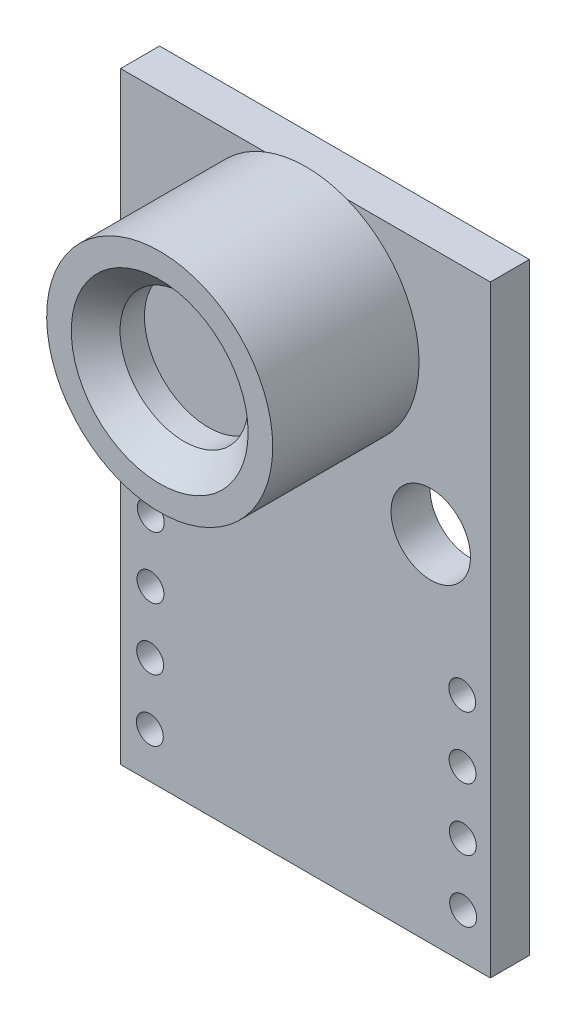
ISO-10303-21;
HEADER;
FILE_DESCRIPTION(('STEP AP214'),'2;1');
FILE_NAME('part.step','',(''),(''),'','','');
FILE_SCHEMA(('AUTOMOTIVE_DESIGN { 1 0 10303 214 1 1 1 1 }'));
ENDSEC;
DATA;
#1=APPLICATION_CONTEXT('core data for automotive mechanical design processes');
#2=APPLICATION_PROTOCOL_DEFINITION('international standard','automotive_design',2000,#1);
#3=PRODUCT_CONTEXT('',#1,'mechanical');
#4=PRODUCT('Part','Part','',(#3));
#5=PRODUCT_RELATED_PRODUCT_CATEGORY('part','',(#4));
#6=PRODUCT_DEFINITION_FORMATION('','',#4);
#7=PRODUCT_DEFINITION_CONTEXT('part definition',#1,'design');
#8=PRODUCT_DEFINITION('design','',#6,#7);
#9=PRODUCT_DEFINITION_SHAPE('','',#8);
#10=(LENGTH_UNIT() NAMED_UNIT(*) SI_UNIT(.MILLI.,.METRE.));
#11=(NAMED_UNIT(*) PLANE_ANGLE_UNIT() SI_UNIT($,.RADIAN.));
#12=(NAMED_UNIT(*) SI_UNIT($,.STERADIAN.) SOLID_ANGLE_UNIT());
#13=UNCERTAINTY_MEASURE_WITH_UNIT(LENGTH_MEASURE(1.E-05),#10,'distance_accuracy_value','');
#14=(GEOMETRIC_REPRESENTATION_CONTEXT(3) GLOBAL_UNCERTAINTY_ASSIGNED_CONTEXT((#13)) GLOBAL_UNIT_ASSIGNED_CONTEXT((#10,
#11,#12)) REPRESENTATION_CONTEXT('',''));
#15=CARTESIAN_POINT('',(0.,0.,0.));
#16=DIRECTION('',(0.,0.,1.));
#17=DIRECTION('',(1.,0.,0.));
#18=AXIS2_PLACEMENT_3D('',#15,#16,#17);
#19=CARTESIAN_POINT('',(0.264950996906967,193.999574927184,-1.6));
#20=DIRECTION('',(-1.,0.,0.));
#21=DIRECTION('',(0.,0.,1.));
#22=AXIS2_PLACEMENT_3D('',#19,#20,#21);
#23=PLANE('',#22);
#24=DIRECTION('',(0.,-1.,0.));
#25=VECTOR('',#24,1.);
#26=CARTESIAN_POINT('',(0.264950996906967,193.999574927184,0.));
#27=LINE('',#26,#25);
#28=CARTESIAN_POINT('',(0.264950996906967,193.999574927184,0.));
#29=VERTEX_POINT('',#28);
#30=CARTESIAN_POINT('',(0.264950996906967,169.281474992154,0.));
#31=VERTEX_POINT('',#30);
#32=EDGE_CURVE('E214',#29,#31,#27,.T.);
#33=ORIENTED_EDGE('',*,*,#32,.F.);
#34=DIRECTION('',(0.,0.,1.));
#35=VECTOR('',#34,1.);
#36=CARTESIAN_POINT('',(0.264950996906967,193.999574927184,-1.6));
#37=LINE('',#36,#35);
#38=CARTESIAN_POINT('',(0.264950996906967,193.999574927184,-1.6));
#39=VERTEX_POINT('',#38);
#40=EDGE_CURVE('E69',#39,#29,#37,.T.);
#41=ORIENTED_EDGE('',*,*,#40,.F.);
#42=DIRECTION('',(0.,-1.,0.));
#43=VECTOR('',#42,1.);
#44=CARTESIAN_POINT('',(0.264950996906967,193.999574927184,-1.6));
#45=LINE('',#44,#43);
#46=CARTESIAN_POINT('',(0.264950996906967,169.281474992154,-1.6));
#47=VERTEX_POINT('',#46);
#48=EDGE_CURVE('E109',#39,#47,#45,.T.);
#49=ORIENTED_EDGE('',*,*,#48,.T.);
#50=DIRECTION('',(0.,0.,1.));
#51=VECTOR('',#50,1.);
#52=CARTESIAN_POINT('',(0.264950996906967,169.281474992154,-1.6));
#53=LINE('',#52,#51);
#54=EDGE_CURVE('E94',#47,#31,#53,.T.);
#55=ORIENTED_EDGE('',*,*,#54,.T.);
#56=EDGE_LOOP('',(#33,#41,#49,#55));
#57=FACE_BOUND('',#56,.T.);
#58=ADVANCED_FACE('F44',(#57),#23,.T.);
#59=CARTESIAN_POINT('',(0.264950996906967,193.999574927184,-1.6));
#60=DIRECTION('',(0.,1.,0.));
#61=DIRECTION('',(0.,0.,1.));
#62=AXIS2_PLACEMENT_3D('',#59,#60,#61);
#63=PLANE('',#62);
#64=DIRECTION('',(-1.,0.,0.));
#65=VECTOR('',#64,1.);
#66=CARTESIAN_POINT('',(0.264950996906967,193.999574927184,0.));
#67=LINE('',#66,#65);
#68=CARTESIAN_POINT('',(15.4280169583826,193.999574927184,0.));
#69=VERTEX_POINT('',#68);
#70=CARTESIAN_POINT('',(9.55157956421883,193.999574927184,0.));
#71=VERTEX_POINT('',#70);
#72=EDGE_CURVE('E100',#69,#71,#67,.T.);
#73=ORIENTED_EDGE('',*,*,#72,.F.);
#74=DIRECTION('',(0.,0.,1.));
#75=VECTOR('',#74,1.);
#76=CARTESIAN_POINT('',(15.4280169583826,193.999574927184,-1.6));
#77=LINE('',#76,#75);
#78=CARTESIAN_POINT('',(15.4280169583826,193.999574927184,-1.6));
#79=VERTEX_POINT('',#78);
#80=EDGE_CURVE('E239',#79,#69,#77,.T.);
#81=ORIENTED_EDGE('',*,*,#80,.F.);
#82=DIRECTION('',(-1.,0.,0.));
#83=VECTOR('',#82,1.);
#84=CARTESIAN_POINT('',(0.264950996906967,193.999574927184,-1.6));
#85=LINE('',#84,#83);
#86=EDGE_CURVE('E227',#79,#39,#85,.T.);
#87=ORIENTED_EDGE('',*,*,#86,.T.);
#88=ORIENTED_EDGE('',*,*,#40,.T.);
#89=CARTESIAN_POINT('',(6.18847631750052,193.999574927184,0.));
#90=VERTEX_POINT('',#89);
#91=EDGE_CURVE('E88',#90,#29,#67,.T.);
#92=ORIENTED_EDGE('',*,*,#91,.F.);
#93=EDGE_CURVE('E110',#71,#90,#67,.T.);
#94=ORIENTED_EDGE('',*,*,#93,.F.);
#95=EDGE_LOOP('',(#73,#81,#87,#88,#92,#94));
#96=FACE_BOUND('',#95,.T.);
#97=ADVANCED_FACE('F113',(#96),#63,.T.);
#98=CARTESIAN_POINT('',(15.4280169583826,193.999574927184,-1.6));
#99=DIRECTION('',(1.,0.,0.));
#100=DIRECTION('',(0.,0.,-1.));
#101=AXIS2_PLACEMENT_3D('',#98,#99,#100);
#102=PLANE('',#101);
#103=DIRECTION('',(0.,1.,0.));
#104=VECTOR('',#103,1.);
#105=CARTESIAN_POINT('',(15.4280169583826,193.999574927184,0.));
#106=LINE('',#105,#104);
#107=CARTESIAN_POINT('',(15.4280169583826,169.281474992154,0.));
#108=VERTEX_POINT('',#107);
#109=EDGE_CURVE('E106',#108,#69,#106,.T.);
#110=ORIENTED_EDGE('',*,*,#109,.F.);
#111=DIRECTION('',(0.,0.,1.));
#112=VECTOR('',#111,1.);
#113=CARTESIAN_POINT('',(15.4280169583826,169.281474992154,-1.6));
#114=LINE('',#113,#112);
#115=CARTESIAN_POINT('',(15.4280169583826,169.281474992154,-1.6));
#116=VERTEX_POINT('',#115);
#117=EDGE_CURVE('E242',#116,#108,#114,.T.);
#118=ORIENTED_EDGE('',*,*,#117,.F.);
#119=DIRECTION('',(0.,1.,0.));
#120=VECTOR('',#119,1.);
#121=CARTESIAN_POINT('',(15.4280169583826,193.999574927184,-1.6));
#122=LINE('',#121,#120);
#123=EDGE_CURVE('E223',#116,#79,#122,.T.);
#124=ORIENTED_EDGE('',*,*,#123,.T.);
#125=ORIENTED_EDGE('',*,*,#80,.T.);
#126=EDGE_LOOP('',(#110,#118,#124,#125));
#127=FACE_BOUND('',#126,.T.);
#128=ADVANCED_FACE('F266',(#127),#102,.T.);
#129=CARTESIAN_POINT('',(0.264950996906967,169.281474992154,-1.6));
#130=DIRECTION('',(0.,-1.,0.));
#131=DIRECTION('',(0.,0.,-1.));
#132=AXIS2_PLACEMENT_3D('',#129,#130,#131);
#133=PLANE('',#132);
#134=DIRECTION('',(1.,0.,0.));
#135=VECTOR('',#134,1.);
#136=CARTESIAN_POINT('',(0.264950996906967,169.281474992154,0.));
#137=LINE('',#136,#135);
#138=EDGE_CURVE('E232',#31,#108,#137,.T.);
#139=ORIENTED_EDGE('',*,*,#138,.F.);
#140=ORIENTED_EDGE('',*,*,#54,.F.);
#141=DIRECTION('',(1.,0.,0.));
#142=VECTOR('',#141,1.);
#143=CARTESIAN_POINT('',(0.264950996906967,169.281474992154,-1.6));
#144=LINE('',#143,#142);
#145=EDGE_CURVE('E220',#47,#116,#144,.T.);
#146=ORIENTED_EDGE('',*,*,#145,.T.);
#147=ORIENTED_EDGE('',*,*,#117,.T.);
#148=EDGE_LOOP('',(#139,#140,#146,#147));
#149=FACE_BOUND('',#148,.T.);
#150=ADVANCED_FACE('F269',(#149),#133,.T.);
#151=CARTESIAN_POINT('',(0.,0.,-1.6));
#152=DIRECTION('',(0.,0.,1.));
#153=DIRECTION('',(1.,0.,0.));
#154=AXIS2_PLACEMENT_3D('',#151,#152,#153);
#155=PLANE('',#154);
#156=CARTESIAN_POINT('',(14.2757724092747,178.757435176001,-1.6));
#157=DIRECTION('',(0.,0.,1.));
#158=DIRECTION('',(-1.,0.,0.));
#159=AXIS2_PLACEMENT_3D('',#156,#157,#158);
#160=CIRCLE('',#159,0.551783112449994);
#161=CARTESIAN_POINT('',(13.7239892968247,178.757435176001,-1.6));
#162=VERTEX_POINT('',#161);
#163=EDGE_CURVE('E138',#162,#162,#160,.T.);
#164=ORIENTED_EDGE('',*,*,#163,.T.);
#165=EDGE_LOOP('',(#164));
#166=FACE_BOUND('',#165,.T.);
#167=CARTESIAN_POINT('',(14.2884354339846,176.217466741589,-1.6));
#168=DIRECTION('',(0.,0.,1.));
#169=DIRECTION('',(-1.,0.,0.));
#170=AXIS2_PLACEMENT_3D('',#167,#168,#169);
#171=CIRCLE('',#170,0.551783112449994);
#172=CARTESIAN_POINT('',(13.7366523215346,176.217466741589,-1.6));
#173=VERTEX_POINT('',#172);
#174=EDGE_CURVE('E146',#173,#173,#171,.T.);
#175=ORIENTED_EDGE('',*,*,#174,.T.);
#176=EDGE_LOOP('',(#175));
#177=FACE_BOUND('',#176,.T.);
#178=CARTESIAN_POINT('',(14.3010984586945,173.677498307178,-1.6));
#179=DIRECTION('',(0.,0.,1.));
#180=DIRECTION('',(-1.,0.,0.));
#181=AXIS2_PLACEMENT_3D('',#178,#179,#180);
#182=CIRCLE('',#181,0.551783112449994);
#183=CARTESIAN_POINT('',(13.7493153462445,173.677498307178,-1.6));
#184=VERTEX_POINT('',#183);
#185=EDGE_CURVE('E154',#184,#184,#182,.T.);
#186=ORIENTED_EDGE('',*,*,#185,.T.);
#187=EDGE_LOOP('',(#186));
#188=FACE_BOUND('',#187,.T.);
#189=CARTESIAN_POINT('',(14.3137614834045,171.137529872767,-1.6));
#190=DIRECTION('',(0.,0.,1.));
#191=DIRECTION('',(-1.,0.,0.));
#192=AXIS2_PLACEMENT_3D('',#189,#190,#191);
#193=CIRCLE('',#192,0.551783112449994);
#194=CARTESIAN_POINT('',(13.7619783709545,171.137529872767,-1.6));
#195=VERTEX_POINT('',#194);
#196=EDGE_CURVE('E162',#195,#195,#193,.T.);
#197=ORIENTED_EDGE('',*,*,#196,.T.);
#198=EDGE_LOOP('',(#197));
#199=FACE_BOUND('',#198,.T.);
#200=CARTESIAN_POINT('',(1.46546972722126,171.137529872767,-1.6));
#201=DIRECTION('',(0.,0.,1.));
#202=DIRECTION('',(1.,0.,0.));
#203=AXIS2_PLACEMENT_3D('',#200,#201,#202);
#204=CIRCLE('',#203,0.551783112449994);
#205=CARTESIAN_POINT('',(2.01725283967125,171.137529872767,-1.6));
#206=VERTEX_POINT('',#205);
#207=EDGE_CURVE('E170',#206,#206,#204,.T.);
#208=ORIENTED_EDGE('',*,*,#207,.T.);
#209=EDGE_LOOP('',(#208));
#210=FACE_BOUND('',#209,.T.);
#211=CARTESIAN_POINT('',(1.47813275193118,173.677498307178,-1.6));
#212=DIRECTION('',(0.,0.,1.));
#213=DIRECTION('',(1.,0.,0.));
#214=AXIS2_PLACEMENT_3D('',#211,#212,#213);
#215=CIRCLE('',#214,0.551783112449994);
#216=CARTESIAN_POINT('',(2.02991586438117,173.677498307178,-1.6));
#217=VERTEX_POINT('',#216);
#218=EDGE_CURVE('E178',#217,#217,#215,.T.);
#219=ORIENTED_EDGE('',*,*,#218,.T.);
#220=EDGE_LOOP('',(#219));
#221=FACE_BOUND('',#220,.T.);
#222=CARTESIAN_POINT('',(1.49079577664109,176.217466741589,-1.6));
#223=DIRECTION('',(0.,0.,1.));
#224=DIRECTION('',(1.,0.,0.));
#225=AXIS2_PLACEMENT_3D('',#222,#223,#224);
#226=CIRCLE('',#225,0.551783112449994);
#227=CARTESIAN_POINT('',(2.04257888909109,176.217466741589,-1.6));
#228=VERTEX_POINT('',#227);
#229=EDGE_CURVE('E186',#228,#228,#226,.T.);
#230=ORIENTED_EDGE('',*,*,#229,.T.);
#231=EDGE_LOOP('',(#230));
#232=FACE_BOUND('',#231,.T.);
#233=CARTESIAN_POINT('',(1.50345880135101,178.757435176001,-1.6));
#234=DIRECTION('',(0.,0.,1.));
#235=DIRECTION('',(1.,0.,0.));
#236=AXIS2_PLACEMENT_3D('',#233,#234,#235);
#237=CIRCLE('',#236,0.551783112449994);
#238=CARTESIAN_POINT('',(2.055241913801,178.757435176001,-1.6));
#239=VERTEX_POINT('',#238);
#240=EDGE_CURVE('E194',#239,#239,#237,.T.);
#241=ORIENTED_EDGE('',*,*,#240,.T.);
#242=EDGE_LOOP('',(#241));
#243=FACE_BOUND('',#242,.T.);
#244=CARTESIAN_POINT('',(12.9858094797718,183.819598972571,-1.6));
#245=DIRECTION('',(0.,0.,1.));
#246=DIRECTION('',(1.,0.,0.));
#247=AXIS2_PLACEMENT_3D('',#244,#245,#246);
#248=CIRCLE('',#247,1.62915548396617);
#249=CARTESIAN_POINT('',(14.614964963738,183.819598972571,-1.6));
#250=VERTEX_POINT('',#249);
#251=EDGE_CURVE('E202',#250,#250,#248,.T.);
#252=ORIENTED_EDGE('',*,*,#251,.T.);
#253=EDGE_LOOP('',(#252));
#254=FACE_BOUND('',#253,.T.);
#255=CARTESIAN_POINT('',(2.74005015873135,183.860713576588,-1.6));
#256=DIRECTION('',(0.,0.,1.));
#257=DIRECTION('',(1.,0.,0.));
#258=AXIS2_PLACEMENT_3D('',#255,#256,#257);
#259=CIRCLE('',#258,1.620437073205);
#260=CARTESIAN_POINT('',(4.36048723193635,183.860713576588,-1.6));
#261=VERTEX_POINT('',#260);
#262=EDGE_CURVE('E210',#261,#261,#259,.T.);
#263=ORIENTED_EDGE('',*,*,#262,.T.);
#264=EDGE_LOOP('',(#263));
#265=FACE_BOUND('',#264,.T.);
#266=ORIENTED_EDGE('',*,*,#48,.F.);
#267=ORIENTED_EDGE('',*,*,#86,.F.);
#268=ORIENTED_EDGE('',*,*,#123,.F.);
#269=ORIENTED_EDGE('',*,*,#145,.F.);
#270=EDGE_LOOP('',(#266,#267,#268,#269));
#271=FACE_BOUND('',#270,.T.);
#272=ADVANCED_FACE('F272',(#166,#177,#188,#199,#210,#221,#232,#243,#254,#265,#271),#155,.F.);
#273=CARTESIAN_POINT('',(0.,0.,0.));
#274=DIRECTION('',(0.,0.,1.));
#275=DIRECTION('',(1.,0.,0.));
#276=AXIS2_PLACEMENT_3D('',#273,#274,#275);
#277=PLANE('',#276);
#278=CARTESIAN_POINT('',(7.87002794085967,189.680070203282,0.));
#279=DIRECTION('',(0.,0.,1.));
#280=DIRECTION('',(1.,0.,0.));
#281=AXIS2_PLACEMENT_3D('',#278,#279,#280);
#282=CIRCLE('',#281,4.63527096530858);
#283=EDGE_CURVE('E60',#90,#71,#282,.T.);
#284=ORIENTED_EDGE('',*,*,#283,.F.);
#285=ORIENTED_EDGE('',*,*,#91,.T.);
#286=ORIENTED_EDGE('',*,*,#32,.T.);
#287=ORIENTED_EDGE('',*,*,#138,.T.);
#288=ORIENTED_EDGE('',*,*,#109,.T.);
#289=ORIENTED_EDGE('',*,*,#72,.T.);
#290=EDGE_LOOP('',(#284,#285,#286,#287,#288,#289));
#291=FACE_BOUND('',#290,.T.);
#292=CARTESIAN_POINT('',(14.2757724092747,178.757435176001,0.));
#293=DIRECTION('',(0.,0.,1.));
#294=DIRECTION('',(-1.,0.,0.));
#295=AXIS2_PLACEMENT_3D('',#292,#293,#294);
#296=CIRCLE('',#295,0.551783112449994);
#297=CARTESIAN_POINT('',(13.7239892968247,178.757435176001,0.));
#298=VERTEX_POINT('',#297);
#299=EDGE_CURVE('E132',#298,#298,#296,.T.);
#300=ORIENTED_EDGE('',*,*,#299,.F.);
#301=EDGE_LOOP('',(#300));
#302=FACE_BOUND('',#301,.T.);
#303=CARTESIAN_POINT('',(14.2884354339846,176.217466741589,0.));
#304=DIRECTION('',(0.,0.,1.));
#305=DIRECTION('',(-1.,0.,0.));
#306=AXIS2_PLACEMENT_3D('',#303,#304,#305);
#307=CIRCLE('',#306,0.551783112449994);
#308=CARTESIAN_POINT('',(13.7366523215346,176.217466741589,0.));
#309=VERTEX_POINT('',#308);
#310=EDGE_CURVE('E142',#309,#309,#307,.T.);
#311=ORIENTED_EDGE('',*,*,#310,.F.);
#312=EDGE_LOOP('',(#311));
#313=FACE_BOUND('',#312,.T.);
#314=CARTESIAN_POINT('',(14.3010984586945,173.677498307178,0.));
#315=DIRECTION('',(0.,0.,1.));
#316=DIRECTION('',(-1.,0.,0.));
#317=AXIS2_PLACEMENT_3D('',#314,#315,#316);
#318=CIRCLE('',#317,0.551783112449994);
#319=CARTESIAN_POINT('',(13.7493153462445,173.677498307178,0.));
#320=VERTEX_POINT('',#319);
#321=EDGE_CURVE('E150',#320,#320,#318,.T.);
#322=ORIENTED_EDGE('',*,*,#321,.F.);
#323=EDGE_LOOP('',(#322));
#324=FACE_BOUND('',#323,.T.);
#325=CARTESIAN_POINT('',(14.3137614834045,171.137529872767,0.));
#326=DIRECTION('',(0.,0.,1.));
#327=DIRECTION('',(-1.,0.,0.));
#328=AXIS2_PLACEMENT_3D('',#325,#326,#327);
#329=CIRCLE('',#328,0.551783112449994);
#330=CARTESIAN_POINT('',(13.7619783709545,171.137529872767,0.));
#331=VERTEX_POINT('',#330);
#332=EDGE_CURVE('E158',#331,#331,#329,.T.);
#333=ORIENTED_EDGE('',*,*,#332,.F.);
#334=EDGE_LOOP('',(#333));
#335=FACE_BOUND('',#334,.T.);
#336=CARTESIAN_POINT('',(1.46546972722126,171.137529872767,0.));
#337=DIRECTION('',(0.,0.,1.));
#338=DIRECTION('',(1.,0.,0.));
#339=AXIS2_PLACEMENT_3D('',#336,#337,#338);
#340=CIRCLE('',#339,0.551783112449994);
#341=CARTESIAN_POINT('',(2.01725283967125,171.137529872767,0.));
#342=VERTEX_POINT('',#341);
#343=EDGE_CURVE('E166',#342,#342,#340,.T.);
#344=ORIENTED_EDGE('',*,*,#343,.F.);
#345=EDGE_LOOP('',(#344));
#346=FACE_BOUND('',#345,.T.);
#347=CARTESIAN_POINT('',(1.47813275193118,173.677498307178,0.));
#348=DIRECTION('',(0.,0.,1.));
#349=DIRECTION('',(1.,0.,0.));
#350=AXIS2_PLACEMENT_3D('',#347,#348,#349);
#351=CIRCLE('',#350,0.551783112449994);
#352=CARTESIAN_POINT('',(2.02991586438117,173.677498307178,0.));
#353=VERTEX_POINT('',#352);
#354=EDGE_CURVE('E174',#353,#353,#351,.T.);
#355=ORIENTED_EDGE('',*,*,#354,.F.);
#356=EDGE_LOOP('',(#355));
#357=FACE_BOUND('',#356,.T.);
#358=CARTESIAN_POINT('',(1.49079577664109,176.217466741589,0.));
#359=DIRECTION('',(0.,0.,1.));
#360=DIRECTION('',(1.,0.,0.));
#361=AXIS2_PLACEMENT_3D('',#358,#359,#360);
#362=CIRCLE('',#361,0.551783112449994);
#363=CARTESIAN_POINT('',(2.04257888909109,176.217466741589,0.));
#364=VERTEX_POINT('',#363);
#365=EDGE_CURVE('E182',#364,#364,#362,.T.);
#366=ORIENTED_EDGE('',*,*,#365,.F.);
#367=EDGE_LOOP('',(#366));
#368=FACE_BOUND('',#367,.T.);
#369=CARTESIAN_POINT('',(1.50345880135101,178.757435176001,0.));
#370=DIRECTION('',(0.,0.,1.));
#371=DIRECTION('',(1.,0.,0.));
#372=AXIS2_PLACEMENT_3D('',#369,#370,#371);
#373=CIRCLE('',#372,0.551783112449994);
#374=CARTESIAN_POINT('',(2.055241913801,178.757435176001,0.));
#375=VERTEX_POINT('',#374);
#376=EDGE_CURVE('E190',#375,#375,#373,.T.);
#377=ORIENTED_EDGE('',*,*,#376,.F.);
#378=EDGE_LOOP('',(#377));
#379=FACE_BOUND('',#378,.T.);
#380=CARTESIAN_POINT('',(12.9858094797718,183.819598972571,0.));
#381=DIRECTION('',(0.,0.,1.));
#382=DIRECTION('',(1.,0.,0.));
#383=AXIS2_PLACEMENT_3D('',#380,#381,#382);
#384=CIRCLE('',#383,1.62915548396617);
#385=CARTESIAN_POINT('',(14.614964963738,183.819598972571,0.));
#386=VERTEX_POINT('',#385);
#387=EDGE_CURVE('E198',#386,#386,#384,.T.);
#388=ORIENTED_EDGE('',*,*,#387,.F.);
#389=EDGE_LOOP('',(#388));
#390=FACE_BOUND('',#389,.T.);
#391=CARTESIAN_POINT('',(2.74005015873135,183.860713576588,0.));
#392=DIRECTION('',(0.,0.,1.));
#393=DIRECTION('',(1.,0.,0.));
#394=AXIS2_PLACEMENT_3D('',#391,#392,#393);
#395=CIRCLE('',#394,1.620437073205);
#396=CARTESIAN_POINT('',(4.36048723193635,183.860713576588,0.));
#397=VERTEX_POINT('',#396);
#398=EDGE_CURVE('E206',#397,#397,#395,.T.);
#399=ORIENTED_EDGE('',*,*,#398,.F.);
#400=EDGE_LOOP('',(#399));
#401=FACE_BOUND('',#400,.T.);
#402=ADVANCED_FACE('F102',(#291,#302,#313,#324,#335,#346,#357,#368,#379,#390,#401),#277,.T.);
#403=CARTESIAN_POINT('',(2.74005015873135,183.860713576588,-1.6));
#404=DIRECTION('',(0.,0.,1.));
#405=DIRECTION('',(1.,0.,0.));
#406=AXIS2_PLACEMENT_3D('',#403,#404,#405);
#407=CYLINDRICAL_SURFACE('',#406,1.620437073205);
#408=ORIENTED_EDGE('',*,*,#262,.F.);
#409=EDGE_LOOP('',(#408));
#410=FACE_BOUND('',#409,.T.);
#411=ORIENTED_EDGE('',*,*,#398,.T.);
#412=EDGE_LOOP('',(#411));
#413=FACE_BOUND('',#412,.T.);
#414=ADVANCED_FACE('F278',(#410,#413),#407,.F.);
#415=CARTESIAN_POINT('',(12.9858094797718,183.819598972571,-1.6));
#416=DIRECTION('',(0.,0.,1.));
#417=DIRECTION('',(1.,0.,0.));
#418=AXIS2_PLACEMENT_3D('',#415,#416,#417);
#419=CYLINDRICAL_SURFACE('',#418,1.62915548396617);
#420=ORIENTED_EDGE('',*,*,#251,.F.);
#421=EDGE_LOOP('',(#420));
#422=FACE_BOUND('',#421,.T.);
#423=ORIENTED_EDGE('',*,*,#387,.T.);
#424=EDGE_LOOP('',(#423));
#425=FACE_BOUND('',#424,.T.);
#426=ADVANCED_FACE('F284',(#422,#425),#419,.F.);
#427=CARTESIAN_POINT('',(1.50345880135101,178.757435176001,-1.6));
#428=DIRECTION('',(0.,0.,1.));
#429=DIRECTION('',(1.,0.,0.));
#430=AXIS2_PLACEMENT_3D('',#427,#428,#429);
#431=CYLINDRICAL_SURFACE('',#430,0.551783112449994);
#432=ORIENTED_EDGE('',*,*,#240,.F.);
#433=EDGE_LOOP('',(#432));
#434=FACE_BOUND('',#433,.T.);
#435=ORIENTED_EDGE('',*,*,#376,.T.);
#436=EDGE_LOOP('',(#435));
#437=FACE_BOUND('',#436,.T.);
#438=ADVANCED_FACE('F288',(#434,#437),#431,.F.);
#439=CARTESIAN_POINT('',(1.49079577664109,176.217466741589,-1.6));
#440=DIRECTION('',(0.,0.,1.));
#441=DIRECTION('',(1.,0.,0.));
#442=AXIS2_PLACEMENT_3D('',#439,#440,#441);
#443=CYLINDRICAL_SURFACE('',#442,0.551783112449994);
#444=ORIENTED_EDGE('',*,*,#229,.F.);
#445=EDGE_LOOP('',(#444));
#446=FACE_BOUND('',#445,.T.);
#447=ORIENTED_EDGE('',*,*,#365,.T.);
#448=EDGE_LOOP('',(#447));
#449=FACE_BOUND('',#448,.T.);
#450=ADVANCED_FACE('F292',(#446,#449),#443,.F.);
#451=CARTESIAN_POINT('',(1.47813275193118,173.677498307178,-1.6));
#452=DIRECTION('',(0.,0.,1.));
#453=DIRECTION('',(1.,0.,0.));
#454=AXIS2_PLACEMENT_3D('',#451,#452,#453);
#455=CYLINDRICAL_SURFACE('',#454,0.551783112449994);
#456=ORIENTED_EDGE('',*,*,#218,.F.);
#457=EDGE_LOOP('',(#456));
#458=FACE_BOUND('',#457,.T.);
#459=ORIENTED_EDGE('',*,*,#354,.T.);
#460=EDGE_LOOP('',(#459));
#461=FACE_BOUND('',#460,.T.);
#462=ADVANCED_FACE('F296',(#458,#461),#455,.F.);
#463=CARTESIAN_POINT('',(1.46546972722126,171.137529872767,-1.6));
#464=DIRECTION('',(0.,0.,1.));
#465=DIRECTION('',(1.,0.,0.));
#466=AXIS2_PLACEMENT_3D('',#463,#464,#465);
#467=CYLINDRICAL_SURFACE('',#466,0.551783112449994);
#468=ORIENTED_EDGE('',*,*,#207,.F.);
#469=EDGE_LOOP('',(#468));
#470=FACE_BOUND('',#469,.T.);
#471=ORIENTED_EDGE('',*,*,#343,.T.);
#472=EDGE_LOOP('',(#471));
#473=FACE_BOUND('',#472,.T.);
#474=ADVANCED_FACE('F300',(#470,#473),#467,.F.);
#475=CARTESIAN_POINT('',(14.3137614834045,171.137529872767,-1.6));
#476=DIRECTION('',(0.,0.,1.));
#477=DIRECTION('',(1.,0.,0.));
#478=AXIS2_PLACEMENT_3D('',#475,#476,#477);
#479=CYLINDRICAL_SURFACE('',#478,0.551783112449994);
#480=ORIENTED_EDGE('',*,*,#196,.F.);
#481=EDGE_LOOP('',(#480));
#482=FACE_BOUND('',#481,.T.);
#483=ORIENTED_EDGE('',*,*,#332,.T.);
#484=EDGE_LOOP('',(#483));
#485=FACE_BOUND('',#484,.T.);
#486=ADVANCED_FACE('F304',(#482,#485),#479,.F.);
#487=CARTESIAN_POINT('',(14.3010984586945,173.677498307178,-1.6));
#488=DIRECTION('',(0.,0.,1.));
#489=DIRECTION('',(1.,0.,0.));
#490=AXIS2_PLACEMENT_3D('',#487,#488,#489);
#491=CYLINDRICAL_SURFACE('',#490,0.551783112449994);
#492=ORIENTED_EDGE('',*,*,#185,.F.);
#493=EDGE_LOOP('',(#492));
#494=FACE_BOUND('',#493,.T.);
#495=ORIENTED_EDGE('',*,*,#321,.T.);
#496=EDGE_LOOP('',(#495));
#497=FACE_BOUND('',#496,.T.);
#498=ADVANCED_FACE('F308',(#494,#497),#491,.F.);
#499=CARTESIAN_POINT('',(14.2884354339846,176.217466741589,-1.6));
#500=DIRECTION('',(0.,0.,1.));
#501=DIRECTION('',(1.,0.,0.));
#502=AXIS2_PLACEMENT_3D('',#499,#500,#501);
#503=CYLINDRICAL_SURFACE('',#502,0.551783112449994);
#504=ORIENTED_EDGE('',*,*,#174,.F.);
#505=EDGE_LOOP('',(#504));
#506=FACE_BOUND('',#505,.T.);
#507=ORIENTED_EDGE('',*,*,#310,.T.);
#508=EDGE_LOOP('',(#507));
#509=FACE_BOUND('',#508,.T.);
#510=ADVANCED_FACE('F312',(#506,#509),#503,.F.);
#511=CARTESIAN_POINT('',(14.2757724092747,178.757435176001,-1.6));
#512=DIRECTION('',(0.,0.,1.));
#513=DIRECTION('',(1.,0.,0.));
#514=AXIS2_PLACEMENT_3D('',#511,#512,#513);
#515=CYLINDRICAL_SURFACE('',#514,0.551783112449994);
#516=ORIENTED_EDGE('',*,*,#163,.F.);
#517=EDGE_LOOP('',(#516));
#518=FACE_BOUND('',#517,.T.);
#519=ORIENTED_EDGE('',*,*,#299,.T.);
#520=EDGE_LOOP('',(#519));
#521=FACE_BOUND('',#520,.T.);
#522=ADVANCED_FACE('F316',(#518,#521),#515,.F.);
#523=CARTESIAN_POINT('',(7.87002794085967,189.680070203282,0.));
#524=DIRECTION('',(0.,0.,1.));
#525=DIRECTION('',(1.,0.,0.));
#526=AXIS2_PLACEMENT_3D('',#523,#524,#525);
#527=PLANE('',#526);
#528=EDGE_CURVE('E120',#71,#90,#282,.T.);
#529=ORIENTED_EDGE('',*,*,#528,.F.);
#530=ORIENTED_EDGE('',*,*,#93,.T.);
#531=EDGE_LOOP('',(#529,#530));
#532=FACE_BOUND('',#531,.T.);
#533=ADVANCED_FACE('F123',(#532),#527,.F.);
#534=CARTESIAN_POINT('',(7.87002794085967,189.680070203282,6.));
#535=DIRECTION('',(0.,0.,-1.));
#536=DIRECTION('',(-1.,0.,0.));
#537=AXIS2_PLACEMENT_3D('',#534,#535,#536);
#538=CYLINDRICAL_SURFACE('',#537,4.63527096530858);
#539=CARTESIAN_POINT('',(7.87002794085967,189.680070203282,6.));
#540=DIRECTION('',(0.,0.,1.));
#541=DIRECTION('',(1.,0.,0.));
#542=AXIS2_PLACEMENT_3D('',#539,#540,#541);
#543=CIRCLE('',#542,4.63527096530858);
#544=CARTESIAN_POINT('',(12.5052989061683,189.680070203282,6.));
#545=VERTEX_POINT('',#544);
#546=EDGE_CURVE('E125',#545,#545,#543,.T.);
#547=ORIENTED_EDGE('',*,*,#546,.F.);
#548=EDGE_LOOP('',(#547));
#549=FACE_BOUND('',#548,.T.);
#550=ORIENTED_EDGE('',*,*,#528,.T.);
#551=ORIENTED_EDGE('',*,*,#283,.T.);
#552=EDGE_LOOP('',(#550,#551));
#553=FACE_BOUND('',#552,.T.);
#554=ADVANCED_FACE('F119',(#549,#553),#538,.T.);
#555=CARTESIAN_POINT('',(7.87002794085967,189.680070203282,6.));
#556=DIRECTION('',(0.,0.,1.));
#557=DIRECTION('',(1.,0.,0.));
#558=AXIS2_PLACEMENT_3D('',#555,#556,#557);
#559=PLANE('',#558);
#560=CARTESIAN_POINT('',(7.87002794085967,189.680070203282,6.));
#561=DIRECTION('',(0.,0.,1.));
#562=DIRECTION('',(1.,0.,0.));
#563=AXIS2_PLACEMENT_3D('',#560,#561,#562);
#564=CIRCLE('',#563,3.62576328644283);
#565=CARTESIAN_POINT('',(11.4957912273025,189.680070203282,6.));
#566=VERTEX_POINT('',#565);
#567=EDGE_CURVE('E11',#566,#566,#564,.F.);
#568=ORIENTED_EDGE('',*,*,#567,.T.);
#569=EDGE_LOOP('',(#568));
#570=FACE_BOUND('',#569,.T.);
#571=ORIENTED_EDGE('',*,*,#546,.T.);
#572=EDGE_LOOP('',(#571));
#573=FACE_BOUND('',#572,.T.);
#574=ADVANCED_FACE('F323',(#570,#573),#559,.T.);
#575=CARTESIAN_POINT('',(7.87002794085967,189.680070203282,4.));
#576=DIRECTION('',(0.,0.,1.));
#577=DIRECTION('',(1.,0.,0.));
#578=AXIS2_PLACEMENT_3D('',#575,#576,#577);
#579=CYLINDRICAL_SURFACE('',#578,2.62576328644283);
#580=CARTESIAN_POINT('',(7.87002794085967,189.680070203282,5.));
#581=DIRECTION('',(0.,0.,1.));
#582=DIRECTION('',(1.,0.,0.));
#583=AXIS2_PLACEMENT_3D('',#580,#581,#582);
#584=CIRCLE('',#583,2.62576328644283);
#585=CARTESIAN_POINT('',(10.4957912273025,189.680070203282,5.));
#586=VERTEX_POINT('',#585);
#587=EDGE_CURVE('E53',#586,#586,#584,.T.);
#588=ORIENTED_EDGE('',*,*,#587,.T.);
#589=EDGE_LOOP('',(#588));
#590=FACE_BOUND('',#589,.T.);
#591=CARTESIAN_POINT('',(7.87002794085967,189.680070203282,4.));
#592=DIRECTION('',(0.,0.,1.));
#593=DIRECTION('',(1.,0.,0.));
#594=AXIS2_PLACEMENT_3D('',#591,#592,#593);
#595=CIRCLE('',#594,2.62576328644283);
#596=CARTESIAN_POINT('',(10.4957912273025,189.680070203282,4.));
#597=VERTEX_POINT('',#596);
#598=EDGE_CURVE('E126',#597,#597,#595,.T.);
#599=ORIENTED_EDGE('',*,*,#598,.F.);
#600=EDGE_LOOP('',(#599));
#601=FACE_BOUND('',#600,.T.);
#602=ADVANCED_FACE('F250',(#590,#601),#579,.F.);
#603=CARTESIAN_POINT('',(7.87002794085967,189.680070203282,4.));
#604=DIRECTION('',(0.,0.,1.));
#605=DIRECTION('',(1.,0.,0.));
#606=AXIS2_PLACEMENT_3D('',#603,#604,#605);
#607=PLANE('',#606);
#608=ORIENTED_EDGE('',*,*,#598,.T.);
#609=EDGE_LOOP('',(#608));
#610=FACE_BOUND('',#609,.T.);
#611=ADVANCED_FACE('F254',(#610),#607,.T.);
#612=CARTESIAN_POINT('',(7.87002794085967,189.680070203282,5.));
#613=DIRECTION('',(0.,0.,1.));
#614=DIRECTION('',(1.,0.,0.));
#615=AXIS2_PLACEMENT_3D('',#612,#613,#614);
#616=CONICAL_SURFACE('',#615,2.62576328644283,0.78539816339745);
#617=ORIENTED_EDGE('',*,*,#567,.F.);
#618=EDGE_LOOP('',(#617));
#619=FACE_BOUND('',#618,.T.);
#620=ORIENTED_EDGE('',*,*,#587,.F.);
#621=EDGE_LOOP('',(#620));
#622=FACE_BOUND('',#621,.T.);
#623=ADVANCED_FACE('F46',(#619,#622),#616,.F.);
#624=CLOSED_SHELL('',(#58,#97,#128,#150,#272,#402,#414,#426,#438,#450,#462,#474,#486,#498,#510,
#522,#533,#554,#574,#602,#611,#623));
#625=MANIFOLD_SOLID_BREP('B2',#624);
#626=ADVANCED_BREP_SHAPE_REPRESENTATION('',(#18,#625),#14);
#627=SHAPE_DEFINITION_REPRESENTATION(#9,#626);
ENDSEC;
END-ISO-10303-21;
